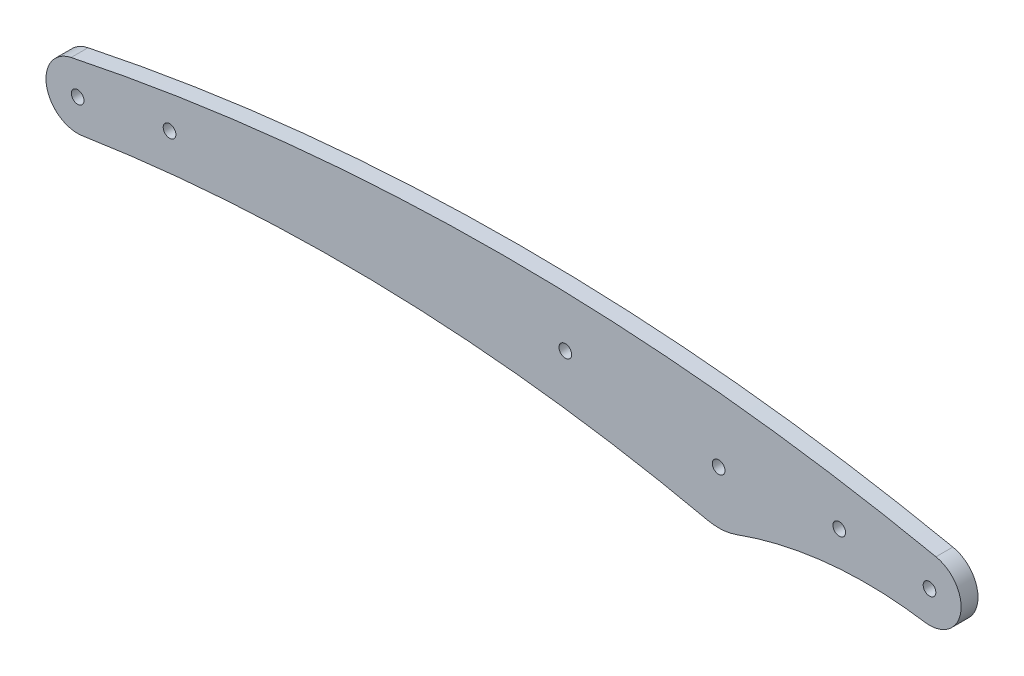
ISO-10303-21;
HEADER;
FILE_DESCRIPTION(('STEP AP214'),'2;1');
FILE_NAME('part.step','',(''),(''),'','','');
FILE_SCHEMA(('AUTOMOTIVE_DESIGN { 1 0 10303 214 1 1 1 1 }'));
ENDSEC;
DATA;
#1=APPLICATION_CONTEXT('core data for automotive mechanical design processes');
#2=APPLICATION_PROTOCOL_DEFINITION('international standard','automotive_design',2000,#1);
#3=PRODUCT_CONTEXT('',#1,'mechanical');
#4=PRODUCT('Part','Part','',(#3));
#5=PRODUCT_RELATED_PRODUCT_CATEGORY('part','',(#4));
#6=PRODUCT_DEFINITION_FORMATION('','',#4);
#7=PRODUCT_DEFINITION_CONTEXT('part definition',#1,'design');
#8=PRODUCT_DEFINITION('design','',#6,#7);
#9=PRODUCT_DEFINITION_SHAPE('','',#8);
#10=(LENGTH_UNIT() NAMED_UNIT(*) SI_UNIT(.MILLI.,.METRE.));
#11=(NAMED_UNIT(*) PLANE_ANGLE_UNIT() SI_UNIT($,.RADIAN.));
#12=(NAMED_UNIT(*) SI_UNIT($,.STERADIAN.) SOLID_ANGLE_UNIT());
#13=UNCERTAINTY_MEASURE_WITH_UNIT(LENGTH_MEASURE(1.E-05),#10,'distance_accuracy_value','');
#14=(GEOMETRIC_REPRESENTATION_CONTEXT(3) GLOBAL_UNCERTAINTY_ASSIGNED_CONTEXT((#13)) GLOBAL_UNIT_ASSIGNED_CONTEXT((#10,
#11,#12)) REPRESENTATION_CONTEXT('',''));
#15=CARTESIAN_POINT('',(0.,0.,0.));
#16=DIRECTION('',(0.,0.,1.));
#17=DIRECTION('',(1.,0.,0.));
#18=AXIS2_PLACEMENT_3D('',#15,#16,#17);
#19=CARTESIAN_POINT('',(31.2565789473684,-201.33824468418,4.));
#20=DIRECTION('',(0.,0.,1.));
#21=DIRECTION('',(1.,0.,0.));
#22=AXIS2_PLACEMENT_3D('',#19,#20,#21);
#23=PLANE('',#22);
#24=CARTESIAN_POINT('',(180.602574062331,1.58663817041305,4.));
#25=DIRECTION('',(0.,0.,1.));
#26=DIRECTION('',(1.,0.,0.));
#27=AXIS2_PLACEMENT_3D('',#24,#25,#26);
#28=CIRCLE('',#27,1.5);
#29=CARTESIAN_POINT('',(182.102574062331,1.58663817041305,4.));
#30=VERTEX_POINT('',#29);
#31=EDGE_CURVE('E164',#30,#30,#28,.T.);
#32=ORIENTED_EDGE('',*,*,#31,.F.);
#33=EDGE_LOOP('',(#32));
#34=FACE_BOUND('',#33,.T.);
#35=CARTESIAN_POINT('',(115.643522850796,5.67392586663605,4.));
#36=DIRECTION('',(0.,0.,1.));
#37=DIRECTION('',(1.,0.,0.));
#38=AXIS2_PLACEMENT_3D('',#35,#36,#37);
#39=CIRCLE('',#38,1.5);
#40=CARTESIAN_POINT('',(117.143522850796,5.67392586663605,4.));
#41=VERTEX_POINT('',#40);
#42=EDGE_CURVE('E154',#41,#41,#39,.T.);
#43=ORIENTED_EDGE('',*,*,#42,.F.);
#44=EDGE_LOOP('',(#43));
#45=FACE_BOUND('',#44,.T.);
#46=CARTESIAN_POINT('',(21.7926473493923,3.92392586663605,4.));
#47=DIRECTION('',(0.,0.,1.));
#48=DIRECTION('',(1.,0.,0.));
#49=AXIS2_PLACEMENT_3D('',#46,#47,#48);
#50=CIRCLE('',#49,1.5);
#51=CARTESIAN_POINT('',(23.2926473493923,3.92392586663605,4.));
#52=VERTEX_POINT('',#51);
#53=EDGE_CURVE('E151',#52,#52,#50,.T.);
#54=ORIENTED_EDGE('',*,*,#53,.F.);
#55=EDGE_LOOP('',(#54));
#56=FACE_BOUND('',#55,.T.);
#57=CARTESIAN_POINT('',(202.,0.,4.));
#58=DIRECTION('',(0.,0.,1.));
#59=DIRECTION('',(1.,0.,0.));
#60=AXIS2_PLACEMENT_3D('',#57,#58,#59);
#61=CIRCLE('',#60,1.5);
#62=CARTESIAN_POINT('',(203.5,0.,4.));
#63=VERTEX_POINT('',#62);
#64=EDGE_CURVE('E173',#63,#63,#61,.T.);
#65=ORIENTED_EDGE('',*,*,#64,.F.);
#66=EDGE_LOOP('',(#65));
#67=FACE_BOUND('',#66,.T.);
#68=CARTESIAN_POINT('',(62.5131578947368,-402.676489368361,4.));
#69=DIRECTION('',(0.,0.,-1.));
#70=DIRECTION('',(1.,0.,0.));
#71=AXIS2_PLACEMENT_3D('',#68,#69,#70);
#72=CIRCLE('',#71,400.);
#73=CARTESIAN_POINT('',(1.15054891830802,-7.4112237307059,4.));
#74=VERTEX_POINT('',#73);
#75=CARTESIAN_POINT('',(149.288277511962,-12.2023178596472,4.));
#76=VERTEX_POINT('',#75);
#77=EDGE_CURVE('E142',#74,#76,#72,.T.);
#78=ORIENTED_EDGE('',*,*,#77,.T.);
#79=CARTESIAN_POINT('',(152.,0.,4.));
#80=DIRECTION('',(0.,0.,1.));
#81=DIRECTION('',(1.,0.,0.));
#82=AXIS2_PLACEMENT_3D('',#79,#80,#81);
#83=CIRCLE('',#82,12.4999999999999);
#84=CARTESIAN_POINT('',(156.268292682927,-11.7486883341449,4.));
#85=VERTEX_POINT('',#84);
#86=EDGE_CURVE('E100',#76,#85,#83,.T.);
#87=ORIENTED_EDGE('',*,*,#86,.T.);
#88=CARTESIAN_POINT('',(187.,-96.3392443399884,4.));
#89=DIRECTION('',(0.,0.,-1.));
#90=DIRECTION('',(1.,0.,0.));
#91=AXIS2_PLACEMENT_3D('',#88,#89,#90);
#92=CIRCLE('',#91,90.);
#93=CARTESIAN_POINT('',(200.846153846154,-7.4107111030761,4.));
#94=VERTEX_POINT('',#93);
#95=EDGE_CURVE('E113',#85,#94,#92,.T.);
#96=ORIENTED_EDGE('',*,*,#95,.T.);
#97=CARTESIAN_POINT('',(202.,0.,4.));
#98=DIRECTION('',(0.,0.,1.));
#99=DIRECTION('',(1.,0.,0.));
#100=AXIS2_PLACEMENT_3D('',#97,#98,#99);
#101=CIRCLE('',#100,7.50000000000006);
#102=CARTESIAN_POINT('',(203.53807106599,7.34059516633123,4.));
#103=VERTEX_POINT('',#102);
#104=EDGE_CURVE('E107',#94,#103,#101,.T.);
#105=ORIENTED_EDGE('',*,*,#104,.T.);
#106=CARTESIAN_POINT('',(101.000000000001,-482.032415922415,4.));
#107=DIRECTION('',(0.,0.,1.));
#108=DIRECTION('',(1.,0.,0.));
#109=AXIS2_PLACEMENT_3D('',#106,#107,#108);
#110=CIRCLE('',#109,500.);
#111=CARTESIAN_POINT('',(-1.53807106598983,7.34059516633106,4.));
#112=VERTEX_POINT('',#111);
#113=EDGE_CURVE('E111',#103,#112,#110,.T.);
#114=ORIENTED_EDGE('',*,*,#113,.T.);
#115=CARTESIAN_POINT('',(0.,0.,4.));
#116=DIRECTION('',(0.,0.,1.));
#117=DIRECTION('',(1.,0.,0.));
#118=AXIS2_PLACEMENT_3D('',#115,#116,#117);
#119=CIRCLE('',#118,7.49999999999986);
#120=EDGE_CURVE('E63',#112,#74,#119,.T.);
#121=ORIENTED_EDGE('',*,*,#120,.T.);
#122=EDGE_LOOP('',(#78,#87,#96,#105,#114,#121));
#123=FACE_BOUND('',#122,.T.);
#124=CARTESIAN_POINT('',(0.,0.,4.));
#125=DIRECTION('',(0.,0.,1.));
#126=DIRECTION('',(1.,0.,0.));
#127=AXIS2_PLACEMENT_3D('',#124,#125,#126);
#128=CIRCLE('',#127,1.5);
#129=CARTESIAN_POINT('',(1.5,0.,4.));
#130=VERTEX_POINT('',#129);
#131=EDGE_CURVE('E135',#130,#130,#128,.T.);
#132=ORIENTED_EDGE('',*,*,#131,.F.);
#133=EDGE_LOOP('',(#132));
#134=FACE_BOUND('',#133,.T.);
#135=CARTESIAN_POINT('',(152.,0.,4.));
#136=DIRECTION('',(0.,0.,1.));
#137=DIRECTION('',(1.,0.,0.));
#138=AXIS2_PLACEMENT_3D('',#135,#136,#137);
#139=CIRCLE('',#138,1.5);
#140=CARTESIAN_POINT('',(153.5,0.,4.));
#141=VERTEX_POINT('',#140);
#142=EDGE_CURVE('E167',#141,#141,#139,.T.);
#143=ORIENTED_EDGE('',*,*,#142,.F.);
#144=EDGE_LOOP('',(#143));
#145=FACE_BOUND('',#144,.T.);
#146=ADVANCED_FACE('F44',(#34,#45,#56,#67,#123,#134,#145),#23,.T.);
#147=CARTESIAN_POINT('',(31.2565789473684,-201.33824468418,0.));
#148=DIRECTION('',(0.,0.,1.));
#149=DIRECTION('',(1.,0.,0.));
#150=AXIS2_PLACEMENT_3D('',#147,#148,#149);
#151=PLANE('',#150);
#152=CARTESIAN_POINT('',(180.602574062331,1.58663817041305,0.));
#153=DIRECTION('',(0.,0.,1.));
#154=DIRECTION('',(1.,0.,0.));
#155=AXIS2_PLACEMENT_3D('',#152,#153,#154);
#156=CIRCLE('',#155,1.5);
#157=CARTESIAN_POINT('',(182.102574062331,1.58663817041305,0.));
#158=VERTEX_POINT('',#157);
#159=EDGE_CURVE('E48',#158,#158,#156,.T.);
#160=ORIENTED_EDGE('',*,*,#159,.T.);
#161=EDGE_LOOP('',(#160));
#162=FACE_BOUND('',#161,.T.);
#163=CARTESIAN_POINT('',(115.643522850796,5.67392586663605,0.));
#164=DIRECTION('',(0.,0.,1.));
#165=DIRECTION('',(1.,0.,0.));
#166=AXIS2_PLACEMENT_3D('',#163,#164,#165);
#167=CIRCLE('',#166,1.5);
#168=CARTESIAN_POINT('',(117.143522850796,5.67392586663605,0.));
#169=VERTEX_POINT('',#168);
#170=EDGE_CURVE('E152',#169,#169,#167,.T.);
#171=ORIENTED_EDGE('',*,*,#170,.T.);
#172=EDGE_LOOP('',(#171));
#173=FACE_BOUND('',#172,.T.);
#174=CARTESIAN_POINT('',(21.7926473493923,3.92392586663605,0.));
#175=DIRECTION('',(0.,0.,1.));
#176=DIRECTION('',(1.,0.,0.));
#177=AXIS2_PLACEMENT_3D('',#174,#175,#176);
#178=CIRCLE('',#177,1.5);
#179=CARTESIAN_POINT('',(23.2926473493923,3.92392586663605,0.));
#180=VERTEX_POINT('',#179);
#181=EDGE_CURVE('E148',#180,#180,#178,.T.);
#182=ORIENTED_EDGE('',*,*,#181,.T.);
#183=EDGE_LOOP('',(#182));
#184=FACE_BOUND('',#183,.T.);
#185=CARTESIAN_POINT('',(202.,0.,0.));
#186=DIRECTION('',(0.,0.,1.));
#187=DIRECTION('',(1.,0.,0.));
#188=AXIS2_PLACEMENT_3D('',#185,#186,#187);
#189=CIRCLE('',#188,1.5);
#190=CARTESIAN_POINT('',(203.5,0.,0.));
#191=VERTEX_POINT('',#190);
#192=EDGE_CURVE('E170',#191,#191,#189,.T.);
#193=ORIENTED_EDGE('',*,*,#192,.T.);
#194=EDGE_LOOP('',(#193));
#195=FACE_BOUND('',#194,.T.);
#196=CARTESIAN_POINT('',(62.5131578947368,-402.676489368361,0.));
#197=DIRECTION('',(0.,0.,-1.));
#198=DIRECTION('',(1.,0.,0.));
#199=AXIS2_PLACEMENT_3D('',#196,#197,#198);
#200=CIRCLE('',#199,400.);
#201=CARTESIAN_POINT('',(1.15054891830802,-7.4112237307059,0.));
#202=VERTEX_POINT('',#201);
#203=CARTESIAN_POINT('',(149.288277511962,-12.2023178596472,0.));
#204=VERTEX_POINT('',#203);
#205=EDGE_CURVE('E131',#202,#204,#200,.T.);
#206=ORIENTED_EDGE('',*,*,#205,.F.);
#207=CARTESIAN_POINT('',(0.,0.,0.));
#208=DIRECTION('',(0.,0.,1.));
#209=DIRECTION('',(1.,0.,0.));
#210=AXIS2_PLACEMENT_3D('',#207,#208,#209);
#211=CIRCLE('',#210,7.49999999999986);
#212=CARTESIAN_POINT('',(-1.53807106598983,7.34059516633106,0.));
#213=VERTEX_POINT('',#212);
#214=EDGE_CURVE('E92',#213,#202,#211,.T.);
#215=ORIENTED_EDGE('',*,*,#214,.F.);
#216=CARTESIAN_POINT('',(101.000000000001,-482.032415922415,0.));
#217=DIRECTION('',(0.,0.,1.));
#218=DIRECTION('',(1.,0.,0.));
#219=AXIS2_PLACEMENT_3D('',#216,#217,#218);
#220=CIRCLE('',#219,500.);
#221=CARTESIAN_POINT('',(203.53807106599,7.34059516633123,0.));
#222=VERTEX_POINT('',#221);
#223=EDGE_CURVE('E86',#222,#213,#220,.T.);
#224=ORIENTED_EDGE('',*,*,#223,.F.);
#225=CARTESIAN_POINT('',(202.,0.,0.));
#226=DIRECTION('',(0.,0.,1.));
#227=DIRECTION('',(1.,0.,0.));
#228=AXIS2_PLACEMENT_3D('',#225,#226,#227);
#229=CIRCLE('',#228,7.50000000000006);
#230=CARTESIAN_POINT('',(200.846153846154,-7.4107111030761,0.));
#231=VERTEX_POINT('',#230);
#232=EDGE_CURVE('E121',#231,#222,#229,.T.);
#233=ORIENTED_EDGE('',*,*,#232,.F.);
#234=CARTESIAN_POINT('',(187.,-96.3392443399884,0.));
#235=DIRECTION('',(0.,0.,-1.));
#236=DIRECTION('',(1.,0.,0.));
#237=AXIS2_PLACEMENT_3D('',#234,#235,#236);
#238=CIRCLE('',#237,90.);
#239=CARTESIAN_POINT('',(156.268292682927,-11.7486883341449,0.));
#240=VERTEX_POINT('',#239);
#241=EDGE_CURVE('E137',#240,#231,#238,.T.);
#242=ORIENTED_EDGE('',*,*,#241,.F.);
#243=CARTESIAN_POINT('',(152.,0.,0.));
#244=DIRECTION('',(0.,0.,1.));
#245=DIRECTION('',(1.,0.,0.));
#246=AXIS2_PLACEMENT_3D('',#243,#244,#245);
#247=CIRCLE('',#246,12.4999999999999);
#248=EDGE_CURVE('E134',#204,#240,#247,.T.);
#249=ORIENTED_EDGE('',*,*,#248,.F.);
#250=EDGE_LOOP('',(#206,#215,#224,#233,#242,#249));
#251=FACE_BOUND('',#250,.T.);
#252=CARTESIAN_POINT('',(0.,0.,0.));
#253=DIRECTION('',(0.,0.,1.));
#254=DIRECTION('',(1.,0.,0.));
#255=AXIS2_PLACEMENT_3D('',#252,#253,#254);
#256=CIRCLE('',#255,1.5);
#257=CARTESIAN_POINT('',(1.5,0.,0.));
#258=VERTEX_POINT('',#257);
#259=EDGE_CURVE('E176',#258,#258,#256,.T.);
#260=ORIENTED_EDGE('',*,*,#259,.T.);
#261=EDGE_LOOP('',(#260));
#262=FACE_BOUND('',#261,.T.);
#263=CARTESIAN_POINT('',(152.,0.,0.));
#264=DIRECTION('',(0.,0.,1.));
#265=DIRECTION('',(1.,0.,0.));
#266=AXIS2_PLACEMENT_3D('',#263,#264,#265);
#267=CIRCLE('',#266,1.5);
#268=CARTESIAN_POINT('',(153.5,0.,0.));
#269=VERTEX_POINT('',#268);
#270=EDGE_CURVE('E150',#269,#269,#267,.T.);
#271=ORIENTED_EDGE('',*,*,#270,.T.);
#272=EDGE_LOOP('',(#271));
#273=FACE_BOUND('',#272,.T.);
#274=ADVANCED_FACE('F192',(#162,#173,#184,#195,#251,#262,#273),#151,.F.);
#275=CARTESIAN_POINT('',(62.5131578947368,-402.676489368361,4.));
#276=DIRECTION('',(0.,0.,-1.));
#277=DIRECTION('',(-1.,0.,0.));
#278=AXIS2_PLACEMENT_3D('',#275,#276,#277);
#279=CYLINDRICAL_SURFACE('',#278,400.);
#280=ORIENTED_EDGE('',*,*,#205,.T.);
#281=DIRECTION('',(0.,0.,-1.));
#282=VECTOR('',#281,1.);
#283=CARTESIAN_POINT('',(149.288277511962,-12.2023178596472,4.));
#284=LINE('',#283,#282);
#285=EDGE_CURVE('E13',#76,#204,#284,.T.);
#286=ORIENTED_EDGE('',*,*,#285,.F.);
#287=ORIENTED_EDGE('',*,*,#77,.F.);
#288=DIRECTION('',(0.,0.,-1.));
#289=VECTOR('',#288,1.);
#290=CARTESIAN_POINT('',(1.15054891830802,-7.4112237307059,4.));
#291=LINE('',#290,#289);
#292=EDGE_CURVE('E127',#74,#202,#291,.T.);
#293=ORIENTED_EDGE('',*,*,#292,.T.);
#294=EDGE_LOOP('',(#280,#286,#287,#293));
#295=FACE_BOUND('',#294,.T.);
#296=ADVANCED_FACE('F46',(#295),#279,.F.);
#297=CARTESIAN_POINT('',(152.,0.,4.));
#298=DIRECTION('',(0.,0.,-1.));
#299=DIRECTION('',(-1.,0.,0.));
#300=AXIS2_PLACEMENT_3D('',#297,#298,#299);
#301=CYLINDRICAL_SURFACE('',#300,12.4999999999999);
#302=ORIENTED_EDGE('',*,*,#248,.T.);
#303=DIRECTION('',(0.,0.,-1.));
#304=VECTOR('',#303,1.);
#305=CARTESIAN_POINT('',(156.268292682927,-11.7486883341449,4.));
#306=LINE('',#305,#304);
#307=EDGE_CURVE('E54',#85,#240,#306,.T.);
#308=ORIENTED_EDGE('',*,*,#307,.F.);
#309=ORIENTED_EDGE('',*,*,#86,.F.);
#310=ORIENTED_EDGE('',*,*,#285,.T.);
#311=EDGE_LOOP('',(#302,#308,#309,#310));
#312=FACE_BOUND('',#311,.T.);
#313=ADVANCED_FACE('F186',(#312),#301,.T.);
#314=CARTESIAN_POINT('',(187.,-96.3392443399884,4.));
#315=DIRECTION('',(0.,0.,-1.));
#316=DIRECTION('',(-1.,0.,0.));
#317=AXIS2_PLACEMENT_3D('',#314,#315,#316);
#318=CYLINDRICAL_SURFACE('',#317,90.);
#319=ORIENTED_EDGE('',*,*,#241,.T.);
#320=DIRECTION('',(0.,0.,-1.));
#321=VECTOR('',#320,1.);
#322=CARTESIAN_POINT('',(200.846153846154,-7.4107111030761,4.));
#323=LINE('',#322,#321);
#324=EDGE_CURVE('E122',#94,#231,#323,.T.);
#325=ORIENTED_EDGE('',*,*,#324,.F.);
#326=ORIENTED_EDGE('',*,*,#95,.F.);
#327=ORIENTED_EDGE('',*,*,#307,.T.);
#328=EDGE_LOOP('',(#319,#325,#326,#327));
#329=FACE_BOUND('',#328,.T.);
#330=ADVANCED_FACE('F189',(#329),#318,.F.);
#331=CARTESIAN_POINT('',(202.,0.,4.));
#332=DIRECTION('',(0.,0.,-1.));
#333=DIRECTION('',(-1.,0.,0.));
#334=AXIS2_PLACEMENT_3D('',#331,#332,#333);
#335=CYLINDRICAL_SURFACE('',#334,7.50000000000006);
#336=ORIENTED_EDGE('',*,*,#232,.T.);
#337=DIRECTION('',(0.,0.,-1.));
#338=VECTOR('',#337,1.);
#339=CARTESIAN_POINT('',(203.53807106599,7.34059516633123,4.));
#340=LINE('',#339,#338);
#341=EDGE_CURVE('E118',#103,#222,#340,.T.);
#342=ORIENTED_EDGE('',*,*,#341,.F.);
#343=ORIENTED_EDGE('',*,*,#104,.F.);
#344=ORIENTED_EDGE('',*,*,#324,.T.);
#345=EDGE_LOOP('',(#336,#342,#343,#344));
#346=FACE_BOUND('',#345,.T.);
#347=ADVANCED_FACE('F119',(#346),#335,.T.);
#348=CARTESIAN_POINT('',(101.000000000001,-482.032415922415,4.));
#349=DIRECTION('',(0.,0.,-1.));
#350=DIRECTION('',(-1.,0.,0.));
#351=AXIS2_PLACEMENT_3D('',#348,#349,#350);
#352=CYLINDRICAL_SURFACE('',#351,500.);
#353=ORIENTED_EDGE('',*,*,#223,.T.);
#354=DIRECTION('',(0.,0.,-1.));
#355=VECTOR('',#354,1.);
#356=CARTESIAN_POINT('',(-1.53807106598983,7.34059516633106,4.));
#357=LINE('',#356,#355);
#358=EDGE_CURVE('E123',#112,#213,#357,.T.);
#359=ORIENTED_EDGE('',*,*,#358,.F.);
#360=ORIENTED_EDGE('',*,*,#113,.F.);
#361=ORIENTED_EDGE('',*,*,#341,.T.);
#362=EDGE_LOOP('',(#353,#359,#360,#361));
#363=FACE_BOUND('',#362,.T.);
#364=ADVANCED_FACE('F125',(#363),#352,.T.);
#365=CARTESIAN_POINT('',(0.,0.,4.));
#366=DIRECTION('',(0.,0.,-1.));
#367=DIRECTION('',(-1.,0.,0.));
#368=AXIS2_PLACEMENT_3D('',#365,#366,#367);
#369=CYLINDRICAL_SURFACE('',#368,7.49999999999986);
#370=ORIENTED_EDGE('',*,*,#214,.T.);
#371=ORIENTED_EDGE('',*,*,#292,.F.);
#372=ORIENTED_EDGE('',*,*,#120,.F.);
#373=ORIENTED_EDGE('',*,*,#358,.T.);
#374=EDGE_LOOP('',(#370,#371,#372,#373));
#375=FACE_BOUND('',#374,.T.);
#376=ADVANCED_FACE('F195',(#375),#369,.T.);
#377=CARTESIAN_POINT('',(0.,0.,4.));
#378=DIRECTION('',(0.,0.,-1.));
#379=DIRECTION('',(-1.,0.,0.));
#380=AXIS2_PLACEMENT_3D('',#377,#378,#379);
#381=CYLINDRICAL_SURFACE('',#380,1.5);
#382=ORIENTED_EDGE('',*,*,#131,.T.);
#383=EDGE_LOOP('',(#382));
#384=FACE_BOUND('',#383,.T.);
#385=ORIENTED_EDGE('',*,*,#259,.F.);
#386=EDGE_LOOP('',(#385));
#387=FACE_BOUND('',#386,.T.);
#388=ADVANCED_FACE('F197',(#384,#387),#381,.F.);
#389=CARTESIAN_POINT('',(202.,0.,4.));
#390=DIRECTION('',(0.,0.,-1.));
#391=DIRECTION('',(-1.,0.,0.));
#392=AXIS2_PLACEMENT_3D('',#389,#390,#391);
#393=CYLINDRICAL_SURFACE('',#392,1.5);
#394=ORIENTED_EDGE('',*,*,#64,.T.);
#395=EDGE_LOOP('',(#394));
#396=FACE_BOUND('',#395,.T.);
#397=ORIENTED_EDGE('',*,*,#192,.F.);
#398=EDGE_LOOP('',(#397));
#399=FACE_BOUND('',#398,.T.);
#400=ADVANCED_FACE('F203',(#396,#399),#393,.F.);
#401=CARTESIAN_POINT('',(152.,0.,4.));
#402=DIRECTION('',(0.,0.,-1.));
#403=DIRECTION('',(-1.,0.,0.));
#404=AXIS2_PLACEMENT_3D('',#401,#402,#403);
#405=CYLINDRICAL_SURFACE('',#404,1.5);
#406=ORIENTED_EDGE('',*,*,#142,.T.);
#407=EDGE_LOOP('',(#406));
#408=FACE_BOUND('',#407,.T.);
#409=ORIENTED_EDGE('',*,*,#270,.F.);
#410=EDGE_LOOP('',(#409));
#411=FACE_BOUND('',#410,.T.);
#412=ADVANCED_FACE('F220',(#408,#411),#405,.F.);
#413=CARTESIAN_POINT('',(21.7926473493923,3.92392586663605,-6.));
#414=DIRECTION('',(0.,0.,1.));
#415=DIRECTION('',(1.,0.,0.));
#416=AXIS2_PLACEMENT_3D('',#413,#414,#415);
#417=CYLINDRICAL_SURFACE('',#416,1.5);
#418=ORIENTED_EDGE('',*,*,#53,.T.);
#419=EDGE_LOOP('',(#418));
#420=FACE_BOUND('',#419,.T.);
#421=ORIENTED_EDGE('',*,*,#181,.F.);
#422=EDGE_LOOP('',(#421));
#423=FACE_BOUND('',#422,.T.);
#424=ADVANCED_FACE('F224',(#420,#423),#417,.F.);
#425=CARTESIAN_POINT('',(115.643522850796,5.67392586663605,-6.));
#426=DIRECTION('',(0.,0.,1.));
#427=DIRECTION('',(1.,0.,0.));
#428=AXIS2_PLACEMENT_3D('',#425,#426,#427);
#429=CYLINDRICAL_SURFACE('',#428,1.5);
#430=ORIENTED_EDGE('',*,*,#42,.T.);
#431=EDGE_LOOP('',(#430));
#432=FACE_BOUND('',#431,.T.);
#433=ORIENTED_EDGE('',*,*,#170,.F.);
#434=EDGE_LOOP('',(#433));
#435=FACE_BOUND('',#434,.T.);
#436=ADVANCED_FACE('F228',(#432,#435),#429,.F.);
#437=CARTESIAN_POINT('',(180.602574062331,1.58663817041305,-6.));
#438=DIRECTION('',(0.,0.,1.));
#439=DIRECTION('',(1.,0.,0.));
#440=AXIS2_PLACEMENT_3D('',#437,#438,#439);
#441=CYLINDRICAL_SURFACE('',#440,1.5);
#442=ORIENTED_EDGE('',*,*,#31,.T.);
#443=EDGE_LOOP('',(#442));
#444=FACE_BOUND('',#443,.T.);
#445=ORIENTED_EDGE('',*,*,#159,.F.);
#446=EDGE_LOOP('',(#445));
#447=FACE_BOUND('',#446,.T.);
#448=ADVANCED_FACE('F232',(#444,#447),#441,.F.);
#449=CLOSED_SHELL('',(#146,#274,#296,#313,#330,#347,#364,#376,#388,#400,#412,#424,#436,#448));
#450=MANIFOLD_SOLID_BREP('B2',#449);
#451=ADVANCED_BREP_SHAPE_REPRESENTATION('',(#18,#450),#14);
#452=SHAPE_DEFINITION_REPRESENTATION(#9,#451);
ENDSEC;
END-ISO-10303-21;
